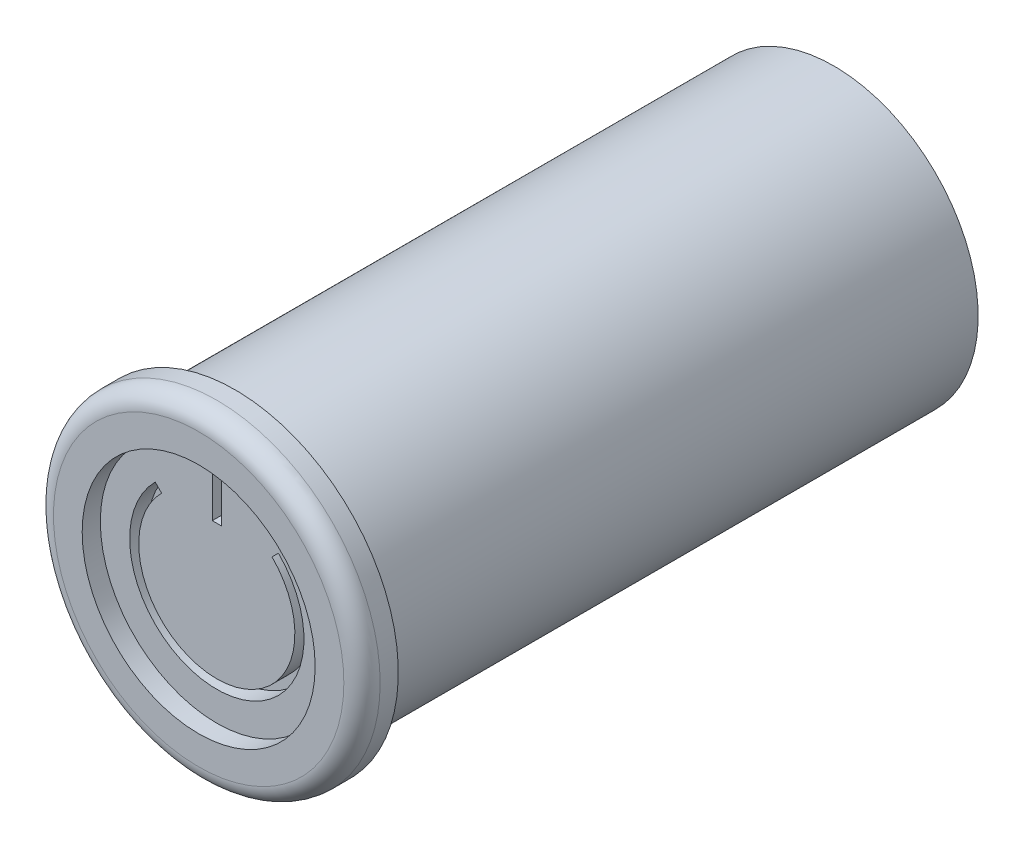
ISO-10303-21;
HEADER;
FILE_DESCRIPTION(('STEP AP214'),'2;1');
FILE_NAME('part.step','',(''),(''),'','','');
FILE_SCHEMA(('AUTOMOTIVE_DESIGN { 1 0 10303 214 1 1 1 1 }'));
ENDSEC;
DATA;
#1=APPLICATION_CONTEXT('core data for automotive mechanical design processes');
#2=APPLICATION_PROTOCOL_DEFINITION('international standard','automotive_design',2000,#1);
#3=PRODUCT_CONTEXT('',#1,'mechanical');
#4=PRODUCT('Part','Part','',(#3));
#5=PRODUCT_RELATED_PRODUCT_CATEGORY('part','',(#4));
#6=PRODUCT_DEFINITION_FORMATION('','',#4);
#7=PRODUCT_DEFINITION_CONTEXT('part definition',#1,'design');
#8=PRODUCT_DEFINITION('design','',#6,#7);
#9=PRODUCT_DEFINITION_SHAPE('','',#8);
#10=(LENGTH_UNIT() NAMED_UNIT(*) SI_UNIT(.MILLI.,.METRE.));
#11=(NAMED_UNIT(*) PLANE_ANGLE_UNIT() SI_UNIT($,.RADIAN.));
#12=(NAMED_UNIT(*) SI_UNIT($,.STERADIAN.) SOLID_ANGLE_UNIT());
#13=UNCERTAINTY_MEASURE_WITH_UNIT(LENGTH_MEASURE(1.E-05),#10,'distance_accuracy_value','');
#14=(GEOMETRIC_REPRESENTATION_CONTEXT(3) GLOBAL_UNCERTAINTY_ASSIGNED_CONTEXT((#13)) GLOBAL_UNIT_ASSIGNED_CONTEXT((#10,
#11,#12)) REPRESENTATION_CONTEXT('',''));
#15=CARTESIAN_POINT('',(0.,0.,0.));
#16=DIRECTION('',(0.,0.,1.));
#17=DIRECTION('',(1.,0.,0.));
#18=AXIS2_PLACEMENT_3D('',#15,#16,#17);
#19=CARTESIAN_POINT('',(0.,0.,35.));
#20=DIRECTION('',(0.,0.,-1.));
#21=DIRECTION('',(-1.,0.,0.));
#22=AXIS2_PLACEMENT_3D('',#19,#20,#21);
#23=CYLINDRICAL_SURFACE('',#22,9.);
#24=CARTESIAN_POINT('',(0.,0.,34.));
#25=DIRECTION('',(0.,0.,1.));
#26=DIRECTION('',(1.,0.,0.));
#27=AXIS2_PLACEMENT_3D('',#24,#25,#26);
#28=CIRCLE('',#27,9.);
#29=CARTESIAN_POINT('',(9.,0.,34.));
#30=VERTEX_POINT('',#29);
#31=EDGE_CURVE('E11',#30,#30,#28,.F.);
#32=ORIENTED_EDGE('',*,*,#31,.T.);
#33=EDGE_LOOP('',(#32));
#34=FACE_BOUND('',#33,.T.);
#35=CARTESIAN_POINT('',(0.,0.,33.));
#36=DIRECTION('',(0.,0.,-1.));
#37=DIRECTION('',(-1.,0.,0.));
#38=AXIS2_PLACEMENT_3D('',#35,#36,#37);
#39=CIRCLE('',#38,9.);
#40=CARTESIAN_POINT('',(-9.,0.,33.));
#41=VERTEX_POINT('',#40);
#42=EDGE_CURVE('E177',#41,#41,#39,.T.);
#43=ORIENTED_EDGE('',*,*,#42,.F.);
#44=EDGE_LOOP('',(#43));
#45=FACE_BOUND('',#44,.T.);
#46=ADVANCED_FACE('F34',(#34,#45),#23,.T.);
#47=CARTESIAN_POINT('',(0.,0.,35.));
#48=DIRECTION('',(0.,0.,1.));
#49=DIRECTION('',(1.,0.,0.));
#50=AXIS2_PLACEMENT_3D('',#47,#48,#49);
#51=PLANE('',#50);
#52=CARTESIAN_POINT('',(0.,0.,35.));
#53=DIRECTION('',(0.,0.,1.));
#54=DIRECTION('',(1.,0.,0.));
#55=AXIS2_PLACEMENT_3D('',#52,#53,#54);
#56=CIRCLE('',#55,6.4185643643739);
#57=CARTESIAN_POINT('',(6.4185643643739,0.,35.));
#58=VERTEX_POINT('',#57);
#59=EDGE_CURVE('E162',#58,#58,#56,.T.);
#60=ORIENTED_EDGE('',*,*,#59,.F.);
#61=EDGE_LOOP('',(#60));
#62=FACE_BOUND('',#61,.T.);
#63=CARTESIAN_POINT('',(0.,0.,35.));
#64=DIRECTION('',(0.,0.,1.));
#65=DIRECTION('',(1.,0.,0.));
#66=AXIS2_PLACEMENT_3D('',#63,#64,#65);
#67=CIRCLE('',#66,8.);
#68=CARTESIAN_POINT('',(8.,0.,35.));
#69=VERTEX_POINT('',#68);
#70=EDGE_CURVE('E42',#69,#69,#67,.T.);
#71=ORIENTED_EDGE('',*,*,#70,.T.);
#72=EDGE_LOOP('',(#71));
#73=FACE_BOUND('',#72,.T.);
#74=ADVANCED_FACE('F184',(#62,#73),#51,.T.);
#75=CARTESIAN_POINT('',(0.,0.,33.));
#76=DIRECTION('',(0.,0.,-1.));
#77=DIRECTION('',(-1.,0.,0.));
#78=AXIS2_PLACEMENT_3D('',#75,#76,#77);
#79=PLANE('',#78);
#80=CARTESIAN_POINT('',(0.,0.,33.));
#81=DIRECTION('',(0.,0.,-1.));
#82=DIRECTION('',(-1.,0.,0.));
#83=AXIS2_PLACEMENT_3D('',#80,#81,#82);
#84=CIRCLE('',#83,7.95);
#85=CARTESIAN_POINT('',(-7.95,0.,33.));
#86=VERTEX_POINT('',#85);
#87=EDGE_CURVE('E174',#86,#86,#84,.T.);
#88=ORIENTED_EDGE('',*,*,#87,.F.);
#89=EDGE_LOOP('',(#88));
#90=FACE_BOUND('',#89,.T.);
#91=ORIENTED_EDGE('',*,*,#42,.T.);
#92=EDGE_LOOP('',(#91));
#93=FACE_BOUND('',#92,.T.);
#94=ADVANCED_FACE('F206',(#90,#93),#79,.T.);
#95=CARTESIAN_POINT('',(0.,0.,33.));
#96=DIRECTION('',(0.,0.,-1.));
#97=DIRECTION('',(-1.,0.,0.));
#98=AXIS2_PLACEMENT_3D('',#95,#96,#97);
#99=CYLINDRICAL_SURFACE('',#98,7.95);
#100=ORIENTED_EDGE('',*,*,#87,.T.);
#101=EDGE_LOOP('',(#100));
#102=FACE_BOUND('',#101,.T.);
#103=CARTESIAN_POINT('',(0.,0.,0.));
#104=DIRECTION('',(0.,0.,-1.));
#105=DIRECTION('',(-1.,0.,0.));
#106=AXIS2_PLACEMENT_3D('',#103,#104,#105);
#107=CIRCLE('',#106,7.95);
#108=CARTESIAN_POINT('',(-7.95,0.,0.));
#109=VERTEX_POINT('',#108);
#110=EDGE_CURVE('E171',#109,#109,#107,.T.);
#111=ORIENTED_EDGE('',*,*,#110,.F.);
#112=EDGE_LOOP('',(#111));
#113=FACE_BOUND('',#112,.T.);
#114=ADVANCED_FACE('F197',(#102,#113),#99,.T.);
#115=CARTESIAN_POINT('',(0.,0.,0.));
#116=DIRECTION('',(0.,0.,1.));
#117=DIRECTION('',(1.,0.,0.));
#118=AXIS2_PLACEMENT_3D('',#115,#116,#117);
#119=PLANE('',#118);
#120=ORIENTED_EDGE('',*,*,#110,.T.);
#121=EDGE_LOOP('',(#120));
#122=FACE_BOUND('',#121,.T.);
#123=ADVANCED_FACE('F188',(#122),#119,.F.);
#124=CARTESIAN_POINT('',(0.,0.,34.));
#125=DIRECTION('',(0.,0.,1.));
#126=DIRECTION('',(1.,0.,0.));
#127=AXIS2_PLACEMENT_3D('',#124,#125,#126);
#128=TOROIDAL_SURFACE('',#127,8.,1.);
#129=ORIENTED_EDGE('',*,*,#31,.F.);
#130=EDGE_LOOP('',(#129));
#131=FACE_BOUND('',#130,.T.);
#132=ORIENTED_EDGE('',*,*,#70,.F.);
#133=EDGE_LOOP('',(#132));
#134=FACE_BOUND('',#133,.T.);
#135=ADVANCED_FACE('F36',(#131,#134),#128,.T.);
#136=CARTESIAN_POINT('',(0.,0.,34.));
#137=DIRECTION('',(0.,0.,1.));
#138=DIRECTION('',(1.,0.,0.));
#139=AXIS2_PLACEMENT_3D('',#136,#137,#138);
#140=CYLINDRICAL_SURFACE('',#139,6.4185643643739);
#141=CARTESIAN_POINT('',(0.,0.,34.));
#142=DIRECTION('',(0.,0.,1.));
#143=DIRECTION('',(1.,0.,0.));
#144=AXIS2_PLACEMENT_3D('',#141,#142,#143);
#145=CIRCLE('',#144,6.4185643643739);
#146=CARTESIAN_POINT('',(6.4185643643739,0.,34.));
#147=VERTEX_POINT('',#146);
#148=EDGE_CURVE('E168',#147,#147,#145,.T.);
#149=ORIENTED_EDGE('',*,*,#148,.F.);
#150=EDGE_LOOP('',(#149));
#151=FACE_BOUND('',#150,.T.);
#152=ORIENTED_EDGE('',*,*,#59,.T.);
#153=EDGE_LOOP('',(#152));
#154=FACE_BOUND('',#153,.T.);
#155=ADVANCED_FACE('F187',(#151,#154),#140,.F.);
#156=CARTESIAN_POINT('',(0.,0.,34.));
#157=DIRECTION('',(0.,0.,1.));
#158=DIRECTION('',(1.,0.,0.));
#159=AXIS2_PLACEMENT_3D('',#156,#157,#158);
#160=PLANE('',#159);
#161=DIRECTION('',(0.,1.,0.));
#162=VECTOR('',#161,1.);
#163=CARTESIAN_POINT('',(0.25,5.47921341080906,34.));
#164=LINE('',#163,#162);
#165=CARTESIAN_POINT('',(0.25,3.12484551679439,34.));
#166=VERTEX_POINT('',#165);
#167=CARTESIAN_POINT('',(0.25,5.47921341080906,34.));
#168=VERTEX_POINT('',#167);
#169=EDGE_CURVE('E49',#166,#168,#164,.T.);
#170=ORIENTED_EDGE('',*,*,#169,.F.);
#171=DIRECTION('',(1.,0.,0.));
#172=VECTOR('',#171,1.);
#173=CARTESIAN_POINT('',(-0.25,3.12484551679439,34.));
#174=LINE('',#173,#172);
#175=CARTESIAN_POINT('',(-0.25,3.12484551679439,34.));
#176=VERTEX_POINT('',#175);
#177=EDGE_CURVE('E119',#176,#166,#174,.T.);
#178=ORIENTED_EDGE('',*,*,#177,.F.);
#179=DIRECTION('',(0.,-1.,0.));
#180=VECTOR('',#179,1.);
#181=CARTESIAN_POINT('',(-0.25,5.47921341080906,34.));
#182=LINE('',#181,#180);
#183=CARTESIAN_POINT('',(-0.25,5.47921341080906,34.));
#184=VERTEX_POINT('',#183);
#185=EDGE_CURVE('E122',#184,#176,#182,.T.);
#186=ORIENTED_EDGE('',*,*,#185,.F.);
#187=DIRECTION('',(-1.,0.,0.));
#188=VECTOR('',#187,1.);
#189=CARTESIAN_POINT('',(-0.25,5.47921341080906,34.));
#190=LINE('',#189,#188);
#191=EDGE_CURVE('E128',#168,#184,#190,.T.);
#192=ORIENTED_EDGE('',*,*,#191,.F.);
#193=EDGE_LOOP('',(#170,#178,#186,#192));
#194=FACE_BOUND('',#193,.T.);
#195=CARTESIAN_POINT('',(0.,0.,34.));
#196=DIRECTION('',(0.,0.,-1.));
#197=DIRECTION('',(1.,0.,0.));
#198=AXIS2_PLACEMENT_3D('',#195,#196,#197);
#199=CIRCLE('',#198,4.30163318916338);
#200=CARTESIAN_POINT('',(3.04171399823455,3.04171399823454,34.));
#201=VERTEX_POINT('',#200);
#202=CARTESIAN_POINT('',(-3.04171399823455,3.04171399823454,34.));
#203=VERTEX_POINT('',#202);
#204=EDGE_CURVE('E57',#201,#203,#199,.T.);
#205=ORIENTED_EDGE('',*,*,#204,.F.);
#206=DIRECTION('',(-0.707106781186549,-0.707106781186546,0.));
#207=VECTOR('',#206,1.);
#208=CARTESIAN_POINT('',(3.04171399823455,3.04171399823454,34.));
#209=LINE('',#208,#207);
#210=CARTESIAN_POINT('',(3.39526738882782,3.39526738882781,34.));
#211=VERTEX_POINT('',#210);
#212=EDGE_CURVE('E141',#211,#201,#209,.T.);
#213=ORIENTED_EDGE('',*,*,#212,.F.);
#214=CARTESIAN_POINT('',(0.,0.,34.));
#215=DIRECTION('',(0.,0.,1.));
#216=DIRECTION('',(1.,0.,0.));
#217=AXIS2_PLACEMENT_3D('',#214,#215,#216);
#218=CIRCLE('',#217,4.80163318916338);
#219=CARTESIAN_POINT('',(-3.39526738882782,3.39526738882781,34.));
#220=VERTEX_POINT('',#219);
#221=EDGE_CURVE('E155',#220,#211,#218,.T.);
#222=ORIENTED_EDGE('',*,*,#221,.F.);
#223=DIRECTION('',(-0.707106781186549,0.707106781186546,0.));
#224=VECTOR('',#223,1.);
#225=CARTESIAN_POINT('',(-3.39526738882782,3.39526738882781,34.));
#226=LINE('',#225,#224);
#227=EDGE_CURVE('E152',#203,#220,#226,.T.);
#228=ORIENTED_EDGE('',*,*,#227,.F.);
#229=EDGE_LOOP('',(#205,#213,#222,#228));
#230=FACE_BOUND('',#229,.T.);
#231=ORIENTED_EDGE('',*,*,#148,.T.);
#232=EDGE_LOOP('',(#231));
#233=FACE_BOUND('',#232,.T.);
#234=ADVANCED_FACE('F194',(#194,#230,#233),#160,.T.);
#235=CARTESIAN_POINT('',(0.,0.,33.));
#236=DIRECTION('',(0.,0.,1.));
#237=DIRECTION('',(1.,0.,0.));
#238=AXIS2_PLACEMENT_3D('',#235,#236,#237);
#239=CYLINDRICAL_SURFACE('',#238,4.30163318916338);
#240=ORIENTED_EDGE('',*,*,#204,.T.);
#241=DIRECTION('',(0.,0.,1.));
#242=VECTOR('',#241,1.);
#243=CARTESIAN_POINT('',(-3.04171399823455,3.04171399823454,33.));
#244=LINE('',#243,#242);
#245=CARTESIAN_POINT('',(-3.04171399823455,3.04171399823454,33.));
#246=VERTEX_POINT('',#245);
#247=EDGE_CURVE('E150',#246,#203,#244,.T.);
#248=ORIENTED_EDGE('',*,*,#247,.F.);
#249=CARTESIAN_POINT('',(0.,0.,33.));
#250=DIRECTION('',(0.,0.,-1.));
#251=DIRECTION('',(1.,0.,0.));
#252=AXIS2_PLACEMENT_3D('',#249,#250,#251);
#253=CIRCLE('',#252,4.30163318916338);
#254=CARTESIAN_POINT('',(3.04171399823455,3.04171399823454,33.));
#255=VERTEX_POINT('',#254);
#256=EDGE_CURVE('E137',#255,#246,#253,.T.);
#257=ORIENTED_EDGE('',*,*,#256,.F.);
#258=DIRECTION('',(0.,0.,1.));
#259=VECTOR('',#258,1.);
#260=CARTESIAN_POINT('',(3.04171399823455,3.04171399823454,33.));
#261=LINE('',#260,#259);
#262=EDGE_CURVE('E160',#255,#201,#261,.T.);
#263=ORIENTED_EDGE('',*,*,#262,.T.);
#264=EDGE_LOOP('',(#240,#248,#257,#263));
#265=FACE_BOUND('',#264,.T.);
#266=ADVANCED_FACE('F219',(#265),#239,.T.);
#267=CARTESIAN_POINT('',(3.04171399823455,3.04171399823454,33.));
#268=DIRECTION('',(-0.707106781186546,0.707106781186549,0.));
#269=DIRECTION('',(-0.707106781186549,-0.707106781186546,0.));
#270=AXIS2_PLACEMENT_3D('',#267,#268,#269);
#271=PLANE('',#270);
#272=ORIENTED_EDGE('',*,*,#212,.T.);
#273=ORIENTED_EDGE('',*,*,#262,.F.);
#274=DIRECTION('',(-0.707106781186549,-0.707106781186546,0.));
#275=VECTOR('',#274,1.);
#276=CARTESIAN_POINT('',(3.04171399823455,3.04171399823454,33.));
#277=LINE('',#276,#275);
#278=CARTESIAN_POINT('',(3.39526738882782,3.39526738882781,33.));
#279=VERTEX_POINT('',#278);
#280=EDGE_CURVE('E147',#279,#255,#277,.T.);
#281=ORIENTED_EDGE('',*,*,#280,.F.);
#282=DIRECTION('',(0.,0.,1.));
#283=VECTOR('',#282,1.);
#284=CARTESIAN_POINT('',(3.39526738882782,3.39526738882781,33.));
#285=LINE('',#284,#283);
#286=EDGE_CURVE('E163',#279,#211,#285,.T.);
#287=ORIENTED_EDGE('',*,*,#286,.T.);
#288=EDGE_LOOP('',(#272,#273,#281,#287));
#289=FACE_BOUND('',#288,.T.);
#290=ADVANCED_FACE('F223',(#289),#271,.F.);
#291=CARTESIAN_POINT('',(0.,0.,33.));
#292=DIRECTION('',(0.,0.,1.));
#293=DIRECTION('',(1.,0.,0.));
#294=AXIS2_PLACEMENT_3D('',#291,#292,#293);
#295=CYLINDRICAL_SURFACE('',#294,4.80163318916338);
#296=ORIENTED_EDGE('',*,*,#221,.T.);
#297=ORIENTED_EDGE('',*,*,#286,.F.);
#298=CARTESIAN_POINT('',(0.,0.,33.));
#299=DIRECTION('',(0.,0.,1.));
#300=DIRECTION('',(1.,0.,0.));
#301=AXIS2_PLACEMENT_3D('',#298,#299,#300);
#302=CIRCLE('',#301,4.80163318916338);
#303=CARTESIAN_POINT('',(-3.39526738882782,3.39526738882781,33.));
#304=VERTEX_POINT('',#303);
#305=EDGE_CURVE('E144',#304,#279,#302,.T.);
#306=ORIENTED_EDGE('',*,*,#305,.F.);
#307=DIRECTION('',(0.,0.,1.));
#308=VECTOR('',#307,1.);
#309=CARTESIAN_POINT('',(-3.39526738882782,3.39526738882781,33.));
#310=LINE('',#309,#308);
#311=EDGE_CURVE('E165',#304,#220,#310,.T.);
#312=ORIENTED_EDGE('',*,*,#311,.T.);
#313=EDGE_LOOP('',(#296,#297,#306,#312));
#314=FACE_BOUND('',#313,.T.);
#315=ADVANCED_FACE('F228',(#314),#295,.F.);
#316=CARTESIAN_POINT('',(-3.39526738882782,3.39526738882781,33.));
#317=DIRECTION('',(0.707106781186546,0.707106781186549,0.));
#318=DIRECTION('',(-0.707106781186549,0.707106781186546,0.));
#319=AXIS2_PLACEMENT_3D('',#316,#317,#318);
#320=PLANE('',#319);
#321=ORIENTED_EDGE('',*,*,#227,.T.);
#322=ORIENTED_EDGE('',*,*,#311,.F.);
#323=DIRECTION('',(-0.707106781186549,0.707106781186546,0.));
#324=VECTOR('',#323,1.);
#325=CARTESIAN_POINT('',(-3.39526738882782,3.39526738882781,33.));
#326=LINE('',#325,#324);
#327=EDGE_CURVE('E140',#246,#304,#326,.T.);
#328=ORIENTED_EDGE('',*,*,#327,.F.);
#329=ORIENTED_EDGE('',*,*,#247,.T.);
#330=EDGE_LOOP('',(#321,#322,#328,#329));
#331=FACE_BOUND('',#330,.T.);
#332=ADVANCED_FACE('F224',(#331),#320,.F.);
#333=CARTESIAN_POINT('',(0.,0.,33.));
#334=DIRECTION('',(0.,0.,1.));
#335=DIRECTION('',(1.,0.,0.));
#336=AXIS2_PLACEMENT_3D('',#333,#334,#335);
#337=PLANE('',#336);
#338=ORIENTED_EDGE('',*,*,#256,.T.);
#339=ORIENTED_EDGE('',*,*,#327,.T.);
#340=ORIENTED_EDGE('',*,*,#305,.T.);
#341=ORIENTED_EDGE('',*,*,#280,.T.);
#342=EDGE_LOOP('',(#338,#339,#340,#341));
#343=FACE_BOUND('',#342,.T.);
#344=ADVANCED_FACE('F227',(#343),#337,.T.);
#345=CARTESIAN_POINT('',(0.25,5.47921341080906,33.));
#346=DIRECTION('',(1.,0.,0.));
#347=DIRECTION('',(0.,1.,0.));
#348=AXIS2_PLACEMENT_3D('',#345,#346,#347);
#349=PLANE('',#348);
#350=ORIENTED_EDGE('',*,*,#169,.T.);
#351=DIRECTION('',(0.,0.,1.));
#352=VECTOR('',#351,1.);
#353=CARTESIAN_POINT('',(0.25,5.47921341080906,33.));
#354=LINE('',#353,#352);
#355=CARTESIAN_POINT('',(0.25,5.47921341080906,33.));
#356=VERTEX_POINT('',#355);
#357=EDGE_CURVE('E97',#356,#168,#354,.T.);
#358=ORIENTED_EDGE('',*,*,#357,.F.);
#359=DIRECTION('',(0.,1.,0.));
#360=VECTOR('',#359,1.);
#361=CARTESIAN_POINT('',(0.25,5.47921341080906,33.));
#362=LINE('',#361,#360);
#363=CARTESIAN_POINT('',(0.25,3.12484551679439,33.));
#364=VERTEX_POINT('',#363);
#365=EDGE_CURVE('E101',#364,#356,#362,.T.);
#366=ORIENTED_EDGE('',*,*,#365,.F.);
#367=DIRECTION('',(0.,0.,1.));
#368=VECTOR('',#367,1.);
#369=CARTESIAN_POINT('',(0.25,3.12484551679439,33.));
#370=LINE('',#369,#368);
#371=EDGE_CURVE('E132',#364,#166,#370,.T.);
#372=ORIENTED_EDGE('',*,*,#371,.T.);
#373=EDGE_LOOP('',(#350,#358,#366,#372));
#374=FACE_BOUND('',#373,.T.);
#375=ADVANCED_FACE('F99',(#374),#349,.F.);
#376=CARTESIAN_POINT('',(-0.25,3.12484551679439,33.));
#377=DIRECTION('',(0.,-1.,0.));
#378=DIRECTION('',(0.,0.,-1.));
#379=AXIS2_PLACEMENT_3D('',#376,#377,#378);
#380=PLANE('',#379);
#381=ORIENTED_EDGE('',*,*,#177,.T.);
#382=ORIENTED_EDGE('',*,*,#371,.F.);
#383=DIRECTION('',(1.,0.,0.));
#384=VECTOR('',#383,1.);
#385=CARTESIAN_POINT('',(-0.25,3.12484551679439,33.));
#386=LINE('',#385,#384);
#387=CARTESIAN_POINT('',(-0.25,3.12484551679439,33.));
#388=VERTEX_POINT('',#387);
#389=EDGE_CURVE('E107',#388,#364,#386,.T.);
#390=ORIENTED_EDGE('',*,*,#389,.F.);
#391=DIRECTION('',(0.,0.,1.));
#392=VECTOR('',#391,1.);
#393=CARTESIAN_POINT('',(-0.25,3.12484551679439,33.));
#394=LINE('',#393,#392);
#395=EDGE_CURVE('E134',#388,#176,#394,.T.);
#396=ORIENTED_EDGE('',*,*,#395,.T.);
#397=EDGE_LOOP('',(#381,#382,#390,#396));
#398=FACE_BOUND('',#397,.T.);
#399=ADVANCED_FACE('F241',(#398),#380,.F.);
#400=CARTESIAN_POINT('',(-0.25,5.47921341080906,33.));
#401=DIRECTION('',(-1.,0.,0.));
#402=DIRECTION('',(0.,-1.,0.));
#403=AXIS2_PLACEMENT_3D('',#400,#401,#402);
#404=PLANE('',#403);
#405=ORIENTED_EDGE('',*,*,#185,.T.);
#406=ORIENTED_EDGE('',*,*,#395,.F.);
#407=DIRECTION('',(0.,-1.,0.));
#408=VECTOR('',#407,1.);
#409=CARTESIAN_POINT('',(-0.25,5.47921341080906,33.));
#410=LINE('',#409,#408);
#411=CARTESIAN_POINT('',(-0.25,5.47921341080906,33.));
#412=VERTEX_POINT('',#411);
#413=EDGE_CURVE('E115',#412,#388,#410,.T.);
#414=ORIENTED_EDGE('',*,*,#413,.F.);
#415=DIRECTION('',(0.,0.,1.));
#416=VECTOR('',#415,1.);
#417=CARTESIAN_POINT('',(-0.25,5.47921341080906,33.));
#418=LINE('',#417,#416);
#419=EDGE_CURVE('E106',#412,#184,#418,.T.);
#420=ORIENTED_EDGE('',*,*,#419,.T.);
#421=EDGE_LOOP('',(#405,#406,#414,#420));
#422=FACE_BOUND('',#421,.T.);
#423=ADVANCED_FACE('F244',(#422),#404,.F.);
#424=CARTESIAN_POINT('',(-0.25,5.47921341080906,33.));
#425=DIRECTION('',(0.,1.,0.));
#426=DIRECTION('',(0.,0.,1.));
#427=AXIS2_PLACEMENT_3D('',#424,#425,#426);
#428=PLANE('',#427);
#429=ORIENTED_EDGE('',*,*,#191,.T.);
#430=ORIENTED_EDGE('',*,*,#419,.F.);
#431=DIRECTION('',(-1.,0.,0.));
#432=VECTOR('',#431,1.);
#433=CARTESIAN_POINT('',(-0.25,5.47921341080906,33.));
#434=LINE('',#433,#432);
#435=EDGE_CURVE('E110',#356,#412,#434,.T.);
#436=ORIENTED_EDGE('',*,*,#435,.F.);
#437=ORIENTED_EDGE('',*,*,#357,.T.);
#438=EDGE_LOOP('',(#429,#430,#436,#437));
#439=FACE_BOUND('',#438,.T.);
#440=ADVANCED_FACE('F111',(#439),#428,.F.);
#441=CARTESIAN_POINT('',(0.,0.,33.));
#442=DIRECTION('',(0.,0.,1.));
#443=DIRECTION('',(1.,0.,0.));
#444=AXIS2_PLACEMENT_3D('',#441,#442,#443);
#445=PLANE('',#444);
#446=ORIENTED_EDGE('',*,*,#365,.T.);
#447=ORIENTED_EDGE('',*,*,#435,.T.);
#448=ORIENTED_EDGE('',*,*,#413,.T.);
#449=ORIENTED_EDGE('',*,*,#389,.T.);
#450=EDGE_LOOP('',(#446,#447,#448,#449));
#451=FACE_BOUND('',#450,.T.);
#452=ADVANCED_FACE('F117',(#451),#445,.T.);
#453=CLOSED_SHELL('',(#46,#74,#94,#114,#123,#135,#155,#234,#266,#290,#315,#332,#344,#375,#399,
#423,#440,#452));
#454=MANIFOLD_SOLID_BREP('B2',#453);
#455=ADVANCED_BREP_SHAPE_REPRESENTATION('',(#18,#454),#14);
#456=SHAPE_DEFINITION_REPRESENTATION(#9,#455);
ENDSEC;
END-ISO-10303-21;
